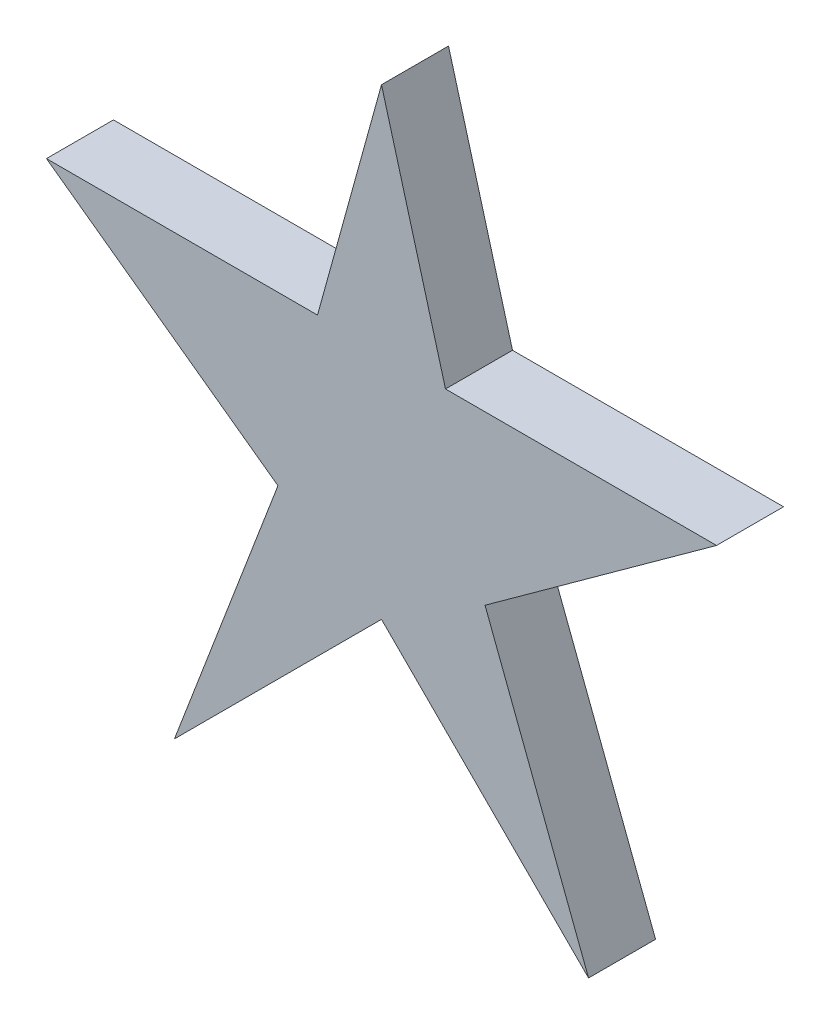
ISO-10303-21;
HEADER;
FILE_DESCRIPTION(('STEP AP214'),'2;1');
FILE_NAME('part.step','',(''),(''),'','','');
FILE_SCHEMA(('AUTOMOTIVE_DESIGN { 1 0 10303 214 1 1 1 1 }'));
ENDSEC;
DATA;
#1=APPLICATION_CONTEXT('core data for automotive mechanical design processes');
#2=APPLICATION_PROTOCOL_DEFINITION('international standard','automotive_design',2000,#1);
#3=PRODUCT_CONTEXT('',#1,'mechanical');
#4=PRODUCT('Part','Part','',(#3));
#5=PRODUCT_RELATED_PRODUCT_CATEGORY('part','',(#4));
#6=PRODUCT_DEFINITION_FORMATION('','',#4);
#7=PRODUCT_DEFINITION_CONTEXT('part definition',#1,'design');
#8=PRODUCT_DEFINITION('design','',#6,#7);
#9=PRODUCT_DEFINITION_SHAPE('','',#8);
#10=(LENGTH_UNIT() NAMED_UNIT(*) SI_UNIT(.MILLI.,.METRE.));
#11=(NAMED_UNIT(*) PLANE_ANGLE_UNIT() SI_UNIT($,.RADIAN.));
#12=(NAMED_UNIT(*) SI_UNIT($,.STERADIAN.) SOLID_ANGLE_UNIT());
#13=UNCERTAINTY_MEASURE_WITH_UNIT(LENGTH_MEASURE(1.E-05),#10,'distance_accuracy_value','');
#14=(GEOMETRIC_REPRESENTATION_CONTEXT(3) GLOBAL_UNCERTAINTY_ASSIGNED_CONTEXT((#13)) GLOBAL_UNIT_ASSIGNED_CONTEXT((#10,
#11,#12)) REPRESENTATION_CONTEXT('',''));
#15=CARTESIAN_POINT('',(0.,0.,0.));
#16=DIRECTION('',(0.,0.,1.));
#17=DIRECTION('',(1.,0.,0.));
#18=AXIS2_PLACEMENT_3D('',#15,#16,#17);
#19=CARTESIAN_POINT('',(-95.5,154.5,100.));
#20=DIRECTION('',(0.963856858814331,-0.266420636806856,0.));
#21=DIRECTION('',(0.266420636806856,0.963856858814331,0.));
#22=AXIS2_PLACEMENT_3D('',#19,#20,#21);
#23=PLANE('',#22);
#24=DIRECTION('',(-0.266420636806856,-0.963856858814331,0.));
#25=VECTOR('',#24,1.);
#26=CARTESIAN_POINT('',(-95.5,154.5,0.));
#27=LINE('',#26,#25);
#28=CARTESIAN_POINT('',(0.,500.,0.));
#29=VERTEX_POINT('',#28);
#30=CARTESIAN_POINT('',(-95.5,154.5,0.));
#31=VERTEX_POINT('',#30);
#32=EDGE_CURVE('E149',#29,#31,#27,.T.);
#33=ORIENTED_EDGE('',*,*,#32,.T.);
#34=DIRECTION('',(0.,0.,-1.));
#35=VECTOR('',#34,1.);
#36=CARTESIAN_POINT('',(-95.5,154.5,100.));
#37=LINE('',#36,#35);
#38=CARTESIAN_POINT('',(-95.5,154.5,100.));
#39=VERTEX_POINT('',#38);
#40=EDGE_CURVE('E11',#39,#31,#37,.T.);
#41=ORIENTED_EDGE('',*,*,#40,.F.);
#42=DIRECTION('',(-0.266420636806856,-0.963856858814331,0.));
#43=VECTOR('',#42,1.);
#44=CARTESIAN_POINT('',(-95.5,154.5,100.));
#45=LINE('',#44,#43);
#46=CARTESIAN_POINT('',(0.,500.,100.));
#47=VERTEX_POINT('',#46);
#48=EDGE_CURVE('E167',#47,#39,#45,.T.);
#49=ORIENTED_EDGE('',*,*,#48,.F.);
#50=DIRECTION('',(0.,0.,-1.));
#51=VECTOR('',#50,1.);
#52=CARTESIAN_POINT('',(0.,500.,100.));
#53=LINE('',#52,#51);
#54=EDGE_CURVE('E145',#47,#29,#53,.T.);
#55=ORIENTED_EDGE('',*,*,#54,.T.);
#56=EDGE_LOOP('',(#33,#41,#49,#55));
#57=FACE_BOUND('',#56,.T.);
#58=ADVANCED_FACE('F41',(#57),#23,.F.);
#59=CARTESIAN_POINT('',(-500.,154.5,100.));
#60=DIRECTION('',(0.,-1.,0.));
#61=DIRECTION('',(0.,0.,-1.));
#62=AXIS2_PLACEMENT_3D('',#59,#60,#61);
#63=PLANE('',#62);
#64=DIRECTION('',(-1.,0.,0.));
#65=VECTOR('',#64,1.);
#66=CARTESIAN_POINT('',(-500.,154.5,0.));
#67=LINE('',#66,#65);
#68=CARTESIAN_POINT('',(-500.,154.5,0.));
#69=VERTEX_POINT('',#68);
#70=EDGE_CURVE('E152',#31,#69,#67,.T.);
#71=ORIENTED_EDGE('',*,*,#70,.T.);
#72=DIRECTION('',(0.,0.,-1.));
#73=VECTOR('',#72,1.);
#74=CARTESIAN_POINT('',(-500.,154.5,100.));
#75=LINE('',#74,#73);
#76=CARTESIAN_POINT('',(-500.,154.5,100.));
#77=VERTEX_POINT('',#76);
#78=EDGE_CURVE('E49',#77,#69,#75,.T.);
#79=ORIENTED_EDGE('',*,*,#78,.F.);
#80=DIRECTION('',(-1.,0.,0.));
#81=VECTOR('',#80,1.);
#82=CARTESIAN_POINT('',(-500.,154.5,100.));
#83=LINE('',#82,#81);
#84=EDGE_CURVE('E106',#39,#77,#83,.T.);
#85=ORIENTED_EDGE('',*,*,#84,.F.);
#86=ORIENTED_EDGE('',*,*,#40,.T.);
#87=EDGE_LOOP('',(#71,#79,#85,#86));
#88=FACE_BOUND('',#87,.T.);
#89=ADVANCED_FACE('F216',(#88),#63,.F.);
#90=CARTESIAN_POINT('',(-154.5,-95.5,100.));
#91=DIRECTION('',(0.586218036891425,0.81015332698395,0.));
#92=DIRECTION('',(-0.81015332698395,0.586218036891426,0.));
#93=AXIS2_PLACEMENT_3D('',#90,#91,#92);
#94=PLANE('',#93);
#95=DIRECTION('',(0.81015332698395,-0.586218036891425,0.));
#96=VECTOR('',#95,1.);
#97=CARTESIAN_POINT('',(-154.5,-95.5,0.));
#98=LINE('',#97,#96);
#99=CARTESIAN_POINT('',(-154.5,-95.5,0.));
#100=VERTEX_POINT('',#99);
#101=EDGE_CURVE('E154',#69,#100,#98,.T.);
#102=ORIENTED_EDGE('',*,*,#101,.T.);
#103=DIRECTION('',(0.,0.,-1.));
#104=VECTOR('',#103,1.);
#105=CARTESIAN_POINT('',(-154.5,-95.5,100.));
#106=LINE('',#105,#104);
#107=CARTESIAN_POINT('',(-154.5,-95.5,100.));
#108=VERTEX_POINT('',#107);
#109=EDGE_CURVE('E180',#108,#100,#106,.T.);
#110=ORIENTED_EDGE('',*,*,#109,.F.);
#111=DIRECTION('',(0.81015332698395,-0.586218036891425,0.));
#112=VECTOR('',#111,1.);
#113=CARTESIAN_POINT('',(-154.5,-95.5,100.));
#114=LINE('',#113,#112);
#115=EDGE_CURVE('E188',#77,#108,#114,.T.);
#116=ORIENTED_EDGE('',*,*,#115,.F.);
#117=ORIENTED_EDGE('',*,*,#78,.T.);
#118=EDGE_LOOP('',(#102,#110,#116,#117));
#119=FACE_BOUND('',#118,.T.);
#120=ADVANCED_FACE('F186',(#119),#94,.F.);
#121=CARTESIAN_POINT('',(-309.,-500.,100.));
#122=DIRECTION('',(0.934176401650764,-0.3568115056985,0.));
#123=DIRECTION('',(0.3568115056985,0.934176401650764,0.));
#124=AXIS2_PLACEMENT_3D('',#121,#122,#123);
#125=PLANE('',#124);
#126=DIRECTION('',(-0.3568115056985,-0.934176401650764,0.));
#127=VECTOR('',#126,1.);
#128=CARTESIAN_POINT('',(-309.,-500.,0.));
#129=LINE('',#128,#127);
#130=CARTESIAN_POINT('',(-309.,-500.,0.));
#131=VERTEX_POINT('',#130);
#132=EDGE_CURVE('E156',#100,#131,#129,.T.);
#133=ORIENTED_EDGE('',*,*,#132,.T.);
#134=DIRECTION('',(0.,0.,-1.));
#135=VECTOR('',#134,1.);
#136=CARTESIAN_POINT('',(-309.,-500.,100.));
#137=LINE('',#136,#135);
#138=CARTESIAN_POINT('',(-309.,-500.,100.));
#139=VERTEX_POINT('',#138);
#140=EDGE_CURVE('E177',#139,#131,#137,.T.);
#141=ORIENTED_EDGE('',*,*,#140,.F.);
#142=DIRECTION('',(-0.3568115056985,-0.934176401650764,0.));
#143=VECTOR('',#142,1.);
#144=CARTESIAN_POINT('',(-309.,-500.,100.));
#145=LINE('',#144,#143);
#146=EDGE_CURVE('E206',#108,#139,#145,.T.);
#147=ORIENTED_EDGE('',*,*,#146,.F.);
#148=ORIENTED_EDGE('',*,*,#109,.T.);
#149=EDGE_LOOP('',(#133,#141,#147,#148));
#150=FACE_BOUND('',#149,.T.);
#151=ADVANCED_FACE('F197',(#150),#125,.F.);
#152=CARTESIAN_POINT('',(0.,-191.,100.));
#153=DIRECTION('',(-0.707106781186547,0.707106781186547,0.));
#154=DIRECTION('',(-0.707106781186548,-0.707106781186548,0.));
#155=AXIS2_PLACEMENT_3D('',#152,#153,#154);
#156=PLANE('',#155);
#157=DIRECTION('',(0.707106781186547,0.707106781186547,0.));
#158=VECTOR('',#157,1.);
#159=CARTESIAN_POINT('',(0.,-191.,0.));
#160=LINE('',#159,#158);
#161=CARTESIAN_POINT('',(0.,-191.,0.));
#162=VERTEX_POINT('',#161);
#163=EDGE_CURVE('E158',#131,#162,#160,.T.);
#164=ORIENTED_EDGE('',*,*,#163,.T.);
#165=DIRECTION('',(0.,0.,-1.));
#166=VECTOR('',#165,1.);
#167=CARTESIAN_POINT('',(0.,-191.,100.));
#168=LINE('',#167,#166);
#169=CARTESIAN_POINT('',(0.,-191.,100.));
#170=VERTEX_POINT('',#169);
#171=EDGE_CURVE('E174',#170,#162,#168,.T.);
#172=ORIENTED_EDGE('',*,*,#171,.F.);
#173=DIRECTION('',(0.707106781186547,0.707106781186547,0.));
#174=VECTOR('',#173,1.);
#175=CARTESIAN_POINT('',(0.,-191.,100.));
#176=LINE('',#175,#174);
#177=EDGE_CURVE('E203',#139,#170,#176,.T.);
#178=ORIENTED_EDGE('',*,*,#177,.F.);
#179=ORIENTED_EDGE('',*,*,#140,.T.);
#180=EDGE_LOOP('',(#164,#172,#178,#179));
#181=FACE_BOUND('',#180,.T.);
#182=ADVANCED_FACE('F201',(#181),#156,.F.);
#183=CARTESIAN_POINT('',(309.,-500.,100.));
#184=DIRECTION('',(0.707106781186547,0.707106781186547,0.));
#185=DIRECTION('',(-0.707106781186548,0.707106781186548,0.));
#186=AXIS2_PLACEMENT_3D('',#183,#184,#185);
#187=PLANE('',#186);
#188=DIRECTION('',(0.707106781186547,-0.707106781186547,0.));
#189=VECTOR('',#188,1.);
#190=CARTESIAN_POINT('',(309.,-500.,0.));
#191=LINE('',#190,#189);
#192=CARTESIAN_POINT('',(309.,-500.,0.));
#193=VERTEX_POINT('',#192);
#194=EDGE_CURVE('E160',#162,#193,#191,.T.);
#195=ORIENTED_EDGE('',*,*,#194,.T.);
#196=DIRECTION('',(0.,0.,-1.));
#197=VECTOR('',#196,1.);
#198=CARTESIAN_POINT('',(309.,-500.,100.));
#199=LINE('',#198,#197);
#200=CARTESIAN_POINT('',(309.,-500.,100.));
#201=VERTEX_POINT('',#200);
#202=EDGE_CURVE('E171',#201,#193,#199,.T.);
#203=ORIENTED_EDGE('',*,*,#202,.F.);
#204=DIRECTION('',(0.707106781186547,-0.707106781186547,0.));
#205=VECTOR('',#204,1.);
#206=CARTESIAN_POINT('',(309.,-500.,100.));
#207=LINE('',#206,#205);
#208=EDGE_CURVE('E205',#170,#201,#207,.T.);
#209=ORIENTED_EDGE('',*,*,#208,.F.);
#210=ORIENTED_EDGE('',*,*,#171,.T.);
#211=EDGE_LOOP('',(#195,#203,#209,#210));
#212=FACE_BOUND('',#211,.T.);
#213=ADVANCED_FACE('F228',(#212),#187,.F.);
#214=CARTESIAN_POINT('',(154.5,-95.5,100.));
#215=DIRECTION('',(-0.934176401650764,-0.3568115056985,0.));
#216=DIRECTION('',(0.3568115056985,-0.934176401650764,0.));
#217=AXIS2_PLACEMENT_3D('',#214,#215,#216);
#218=PLANE('',#217);
#219=DIRECTION('',(-0.3568115056985,0.934176401650764,0.));
#220=VECTOR('',#219,1.);
#221=CARTESIAN_POINT('',(154.5,-95.5,0.));
#222=LINE('',#221,#220);
#223=CARTESIAN_POINT('',(154.5,-95.5,0.));
#224=VERTEX_POINT('',#223);
#225=EDGE_CURVE('E162',#193,#224,#222,.T.);
#226=ORIENTED_EDGE('',*,*,#225,.T.);
#227=DIRECTION('',(0.,0.,-1.));
#228=VECTOR('',#227,1.);
#229=CARTESIAN_POINT('',(154.5,-95.5,100.));
#230=LINE('',#229,#228);
#231=CARTESIAN_POINT('',(154.5,-95.5,100.));
#232=VERTEX_POINT('',#231);
#233=EDGE_CURVE('E140',#232,#224,#230,.T.);
#234=ORIENTED_EDGE('',*,*,#233,.F.);
#235=DIRECTION('',(-0.3568115056985,0.934176401650764,0.));
#236=VECTOR('',#235,1.);
#237=CARTESIAN_POINT('',(154.5,-95.5,100.));
#238=LINE('',#237,#236);
#239=EDGE_CURVE('E131',#201,#232,#238,.T.);
#240=ORIENTED_EDGE('',*,*,#239,.F.);
#241=ORIENTED_EDGE('',*,*,#202,.T.);
#242=EDGE_LOOP('',(#226,#234,#240,#241));
#243=FACE_BOUND('',#242,.T.);
#244=ADVANCED_FACE('F231',(#243),#218,.F.);
#245=CARTESIAN_POINT('',(500.,154.5,100.));
#246=DIRECTION('',(-0.586218036891425,0.81015332698395,0.));
#247=DIRECTION('',(-0.81015332698395,-0.586218036891426,0.));
#248=AXIS2_PLACEMENT_3D('',#245,#246,#247);
#249=PLANE('',#248);
#250=DIRECTION('',(0.81015332698395,0.586218036891425,0.));
#251=VECTOR('',#250,1.);
#252=CARTESIAN_POINT('',(500.,154.5,0.));
#253=LINE('',#252,#251);
#254=CARTESIAN_POINT('',(500.,154.5,0.));
#255=VERTEX_POINT('',#254);
#256=EDGE_CURVE('E139',#224,#255,#253,.T.);
#257=ORIENTED_EDGE('',*,*,#256,.T.);
#258=DIRECTION('',(0.,0.,-1.));
#259=VECTOR('',#258,1.);
#260=CARTESIAN_POINT('',(500.,154.5,100.));
#261=LINE('',#260,#259);
#262=CARTESIAN_POINT('',(500.,154.5,100.));
#263=VERTEX_POINT('',#262);
#264=EDGE_CURVE('E136',#263,#255,#261,.T.);
#265=ORIENTED_EDGE('',*,*,#264,.F.);
#266=DIRECTION('',(0.81015332698395,0.586218036891425,0.));
#267=VECTOR('',#266,1.);
#268=CARTESIAN_POINT('',(500.,154.5,100.));
#269=LINE('',#268,#267);
#270=EDGE_CURVE('E125',#232,#263,#269,.T.);
#271=ORIENTED_EDGE('',*,*,#270,.F.);
#272=ORIENTED_EDGE('',*,*,#233,.T.);
#273=EDGE_LOOP('',(#257,#265,#271,#272));
#274=FACE_BOUND('',#273,.T.);
#275=ADVANCED_FACE('F137',(#274),#249,.F.);
#276=CARTESIAN_POINT('',(95.5,154.5,100.));
#277=DIRECTION('',(0.,-1.,0.));
#278=DIRECTION('',(0.,0.,-1.));
#279=AXIS2_PLACEMENT_3D('',#276,#277,#278);
#280=PLANE('',#279);
#281=DIRECTION('',(-1.,0.,0.));
#282=VECTOR('',#281,1.);
#283=CARTESIAN_POINT('',(95.5,154.5,0.));
#284=LINE('',#283,#282);
#285=CARTESIAN_POINT('',(95.5,154.5,0.));
#286=VERTEX_POINT('',#285);
#287=EDGE_CURVE('E92',#255,#286,#284,.T.);
#288=ORIENTED_EDGE('',*,*,#287,.T.);
#289=DIRECTION('',(0.,0.,-1.));
#290=VECTOR('',#289,1.);
#291=CARTESIAN_POINT('',(95.5,154.5,100.));
#292=LINE('',#291,#290);
#293=CARTESIAN_POINT('',(95.5,154.5,100.));
#294=VERTEX_POINT('',#293);
#295=EDGE_CURVE('E141',#294,#286,#292,.T.);
#296=ORIENTED_EDGE('',*,*,#295,.F.);
#297=DIRECTION('',(-1.,0.,0.));
#298=VECTOR('',#297,1.);
#299=CARTESIAN_POINT('',(95.5,154.5,100.));
#300=LINE('',#299,#298);
#301=EDGE_CURVE('E129',#263,#294,#300,.T.);
#302=ORIENTED_EDGE('',*,*,#301,.F.);
#303=ORIENTED_EDGE('',*,*,#264,.T.);
#304=EDGE_LOOP('',(#288,#296,#302,#303));
#305=FACE_BOUND('',#304,.T.);
#306=ADVANCED_FACE('F143',(#305),#280,.F.);
#307=CARTESIAN_POINT('',(0.,500.,100.));
#308=DIRECTION('',(-0.963856858814331,-0.266420636806856,0.));
#309=DIRECTION('',(0.266420636806856,-0.963856858814331,0.));
#310=AXIS2_PLACEMENT_3D('',#307,#308,#309);
#311=PLANE('',#310);
#312=DIRECTION('',(-0.266420636806856,0.963856858814331,0.));
#313=VECTOR('',#312,1.);
#314=CARTESIAN_POINT('',(0.,500.,0.));
#315=LINE('',#314,#313);
#316=EDGE_CURVE('E98',#286,#29,#315,.T.);
#317=ORIENTED_EDGE('',*,*,#316,.T.);
#318=ORIENTED_EDGE('',*,*,#54,.F.);
#319=DIRECTION('',(-0.266420636806856,0.963856858814331,0.));
#320=VECTOR('',#319,1.);
#321=CARTESIAN_POINT('',(0.,500.,100.));
#322=LINE('',#321,#320);
#323=EDGE_CURVE('E57',#294,#47,#322,.T.);
#324=ORIENTED_EDGE('',*,*,#323,.F.);
#325=ORIENTED_EDGE('',*,*,#295,.T.);
#326=EDGE_LOOP('',(#317,#318,#324,#325));
#327=FACE_BOUND('',#326,.T.);
#328=ADVANCED_FACE('F240',(#327),#311,.F.);
#329=CARTESIAN_POINT('',(0.,0.,100.));
#330=DIRECTION('',(0.,0.,-1.));
#331=DIRECTION('',(-1.,0.,0.));
#332=AXIS2_PLACEMENT_3D('',#329,#330,#331);
#333=PLANE('',#332);
#334=ORIENTED_EDGE('',*,*,#48,.T.);
#335=ORIENTED_EDGE('',*,*,#84,.T.);
#336=ORIENTED_EDGE('',*,*,#115,.T.);
#337=ORIENTED_EDGE('',*,*,#146,.T.);
#338=ORIENTED_EDGE('',*,*,#177,.T.);
#339=ORIENTED_EDGE('',*,*,#208,.T.);
#340=ORIENTED_EDGE('',*,*,#239,.T.);
#341=ORIENTED_EDGE('',*,*,#270,.T.);
#342=ORIENTED_EDGE('',*,*,#301,.T.);
#343=ORIENTED_EDGE('',*,*,#323,.T.);
#344=EDGE_LOOP('',(#334,#335,#336,#337,#338,#339,#340,#341,#342,#343));
#345=FACE_BOUND('',#344,.T.);
#346=ADVANCED_FACE('F127',(#345),#333,.F.);
#347=CARTESIAN_POINT('',(0.,0.,0.));
#348=DIRECTION('',(0.,0.,-1.));
#349=DIRECTION('',(-1.,0.,0.));
#350=AXIS2_PLACEMENT_3D('',#347,#348,#349);
#351=PLANE('',#350);
#352=ORIENTED_EDGE('',*,*,#32,.F.);
#353=ORIENTED_EDGE('',*,*,#316,.F.);
#354=ORIENTED_EDGE('',*,*,#287,.F.);
#355=ORIENTED_EDGE('',*,*,#256,.F.);
#356=ORIENTED_EDGE('',*,*,#225,.F.);
#357=ORIENTED_EDGE('',*,*,#194,.F.);
#358=ORIENTED_EDGE('',*,*,#163,.F.);
#359=ORIENTED_EDGE('',*,*,#132,.F.);
#360=ORIENTED_EDGE('',*,*,#101,.F.);
#361=ORIENTED_EDGE('',*,*,#70,.F.);
#362=EDGE_LOOP('',(#352,#353,#354,#355,#356,#357,#358,#359,#360,#361));
#363=FACE_BOUND('',#362,.T.);
#364=ADVANCED_FACE('F192',(#363),#351,.T.);
#365=CLOSED_SHELL('',(#58,#89,#120,#151,#182,#213,#244,#275,#306,#328,#346,#364));
#366=MANIFOLD_SOLID_BREP('B2',#365);
#367=ADVANCED_BREP_SHAPE_REPRESENTATION('',(#18,#366),#14);
#368=SHAPE_DEFINITION_REPRESENTATION(#9,#367);
ENDSEC;
END-ISO-10303-21;
